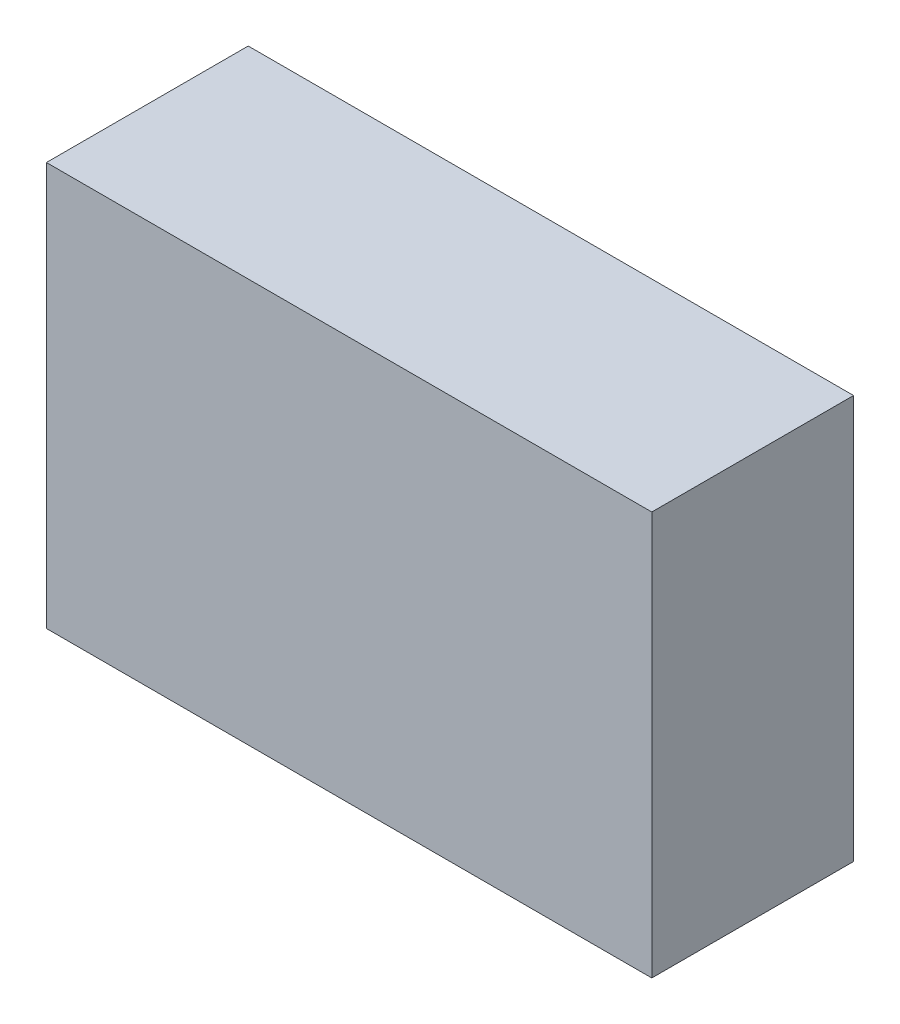
ISO-10303-21;
HEADER;
FILE_DESCRIPTION(('STEP AP214'),'2;1');
FILE_NAME('part.step','',(''),(''),'','','');
FILE_SCHEMA(('AUTOMOTIVE_DESIGN { 1 0 10303 214 1 1 1 1 }'));
ENDSEC;
DATA;
#1=APPLICATION_CONTEXT('core data for automotive mechanical design processes');
#2=APPLICATION_PROTOCOL_DEFINITION('international standard','automotive_design',2000,#1);
#3=PRODUCT_CONTEXT('',#1,'mechanical');
#4=PRODUCT('Part','Part','',(#3));
#5=PRODUCT_RELATED_PRODUCT_CATEGORY('part','',(#4));
#6=PRODUCT_DEFINITION_FORMATION('','',#4);
#7=PRODUCT_DEFINITION_CONTEXT('part definition',#1,'design');
#8=PRODUCT_DEFINITION('design','',#6,#7);
#9=PRODUCT_DEFINITION_SHAPE('','',#8);
#10=(LENGTH_UNIT() NAMED_UNIT(*) SI_UNIT(.MILLI.,.METRE.));
#11=(NAMED_UNIT(*) PLANE_ANGLE_UNIT() SI_UNIT($,.RADIAN.));
#12=(NAMED_UNIT(*) SI_UNIT($,.STERADIAN.) SOLID_ANGLE_UNIT());
#13=UNCERTAINTY_MEASURE_WITH_UNIT(LENGTH_MEASURE(1.E-05),#10,'distance_accuracy_value','');
#14=(GEOMETRIC_REPRESENTATION_CONTEXT(3) GLOBAL_UNCERTAINTY_ASSIGNED_CONTEXT((#13)) GLOBAL_UNIT_ASSIGNED_CONTEXT((#10,
#11,#12)) REPRESENTATION_CONTEXT('',''));
#15=CARTESIAN_POINT('',(0.,0.,0.));
#16=DIRECTION('',(0.,0.,1.));
#17=DIRECTION('',(1.,0.,0.));
#18=AXIS2_PLACEMENT_3D('',#15,#16,#17);
#19=CARTESIAN_POINT('',(0.,0.,1.));
#20=DIRECTION('',(1.,0.,0.));
#21=DIRECTION('',(0.,0.,-1.));
#22=AXIS2_PLACEMENT_3D('',#19,#20,#21);
#23=PLANE('',#22);
#24=DIRECTION('',(0.,-1.,0.));
#25=VECTOR('',#24,1.);
#26=CARTESIAN_POINT('',(0.,0.,0.));
#27=LINE('',#26,#25);
#28=CARTESIAN_POINT('',(0.,2.,0.));
#29=VERTEX_POINT('',#28);
#30=CARTESIAN_POINT('',(0.,0.,0.));
#31=VERTEX_POINT('',#30);
#32=EDGE_CURVE('E107',#29,#31,#27,.T.);
#33=ORIENTED_EDGE('',*,*,#32,.T.);
#34=DIRECTION('',(0.,0.,-1.));
#35=VECTOR('',#34,1.);
#36=CARTESIAN_POINT('',(0.,0.,1.));
#37=LINE('',#36,#35);
#38=CARTESIAN_POINT('',(0.,0.,1.));
#39=VERTEX_POINT('',#38);
#40=EDGE_CURVE('E11',#39,#31,#37,.T.);
#41=ORIENTED_EDGE('',*,*,#40,.F.);
#42=DIRECTION('',(0.,-1.,0.));
#43=VECTOR('',#42,1.);
#44=CARTESIAN_POINT('',(0.,0.,1.));
#45=LINE('',#44,#43);
#46=CARTESIAN_POINT('',(0.,2.,1.));
#47=VERTEX_POINT('',#46);
#48=EDGE_CURVE('E91',#47,#39,#45,.T.);
#49=ORIENTED_EDGE('',*,*,#48,.F.);
#50=DIRECTION('',(0.,0.,-1.));
#51=VECTOR('',#50,1.);
#52=CARTESIAN_POINT('',(0.,2.,1.));
#53=LINE('',#52,#51);
#54=EDGE_CURVE('E103',#47,#29,#53,.T.);
#55=ORIENTED_EDGE('',*,*,#54,.T.);
#56=EDGE_LOOP('',(#33,#41,#49,#55));
#57=FACE_BOUND('',#56,.T.);
#58=ADVANCED_FACE('F39',(#57),#23,.F.);
#59=CARTESIAN_POINT('',(0.,0.,1.));
#60=DIRECTION('',(0.,1.,0.));
#61=DIRECTION('',(0.,0.,1.));
#62=AXIS2_PLACEMENT_3D('',#59,#60,#61);
#63=PLANE('',#62);
#64=DIRECTION('',(1.,0.,0.));
#65=VECTOR('',#64,1.);
#66=CARTESIAN_POINT('',(0.,0.,0.));
#67=LINE('',#66,#65);
#68=CARTESIAN_POINT('',(3.,0.,0.));
#69=VERTEX_POINT('',#68);
#70=EDGE_CURVE('E96',#31,#69,#67,.T.);
#71=ORIENTED_EDGE('',*,*,#70,.T.);
#72=DIRECTION('',(0.,0.,-1.));
#73=VECTOR('',#72,1.);
#74=CARTESIAN_POINT('',(3.,0.,1.));
#75=LINE('',#74,#73);
#76=CARTESIAN_POINT('',(3.,0.,1.));
#77=VERTEX_POINT('',#76);
#78=EDGE_CURVE('E48',#77,#69,#75,.T.);
#79=ORIENTED_EDGE('',*,*,#78,.F.);
#80=DIRECTION('',(1.,0.,0.));
#81=VECTOR('',#80,1.);
#82=CARTESIAN_POINT('',(0.,0.,1.));
#83=LINE('',#82,#81);
#84=EDGE_CURVE('E86',#39,#77,#83,.T.);
#85=ORIENTED_EDGE('',*,*,#84,.F.);
#86=ORIENTED_EDGE('',*,*,#40,.T.);
#87=EDGE_LOOP('',(#71,#79,#85,#86));
#88=FACE_BOUND('',#87,.T.);
#89=ADVANCED_FACE('F95',(#88),#63,.F.);
#90=CARTESIAN_POINT('',(3.,0.,1.));
#91=DIRECTION('',(-1.,0.,0.));
#92=DIRECTION('',(0.,0.,1.));
#93=AXIS2_PLACEMENT_3D('',#90,#91,#92);
#94=PLANE('',#93);
#95=DIRECTION('',(0.,1.,0.));
#96=VECTOR('',#95,1.);
#97=CARTESIAN_POINT('',(3.,0.,0.));
#98=LINE('',#97,#96);
#99=CARTESIAN_POINT('',(3.,2.,0.));
#100=VERTEX_POINT('',#99);
#101=EDGE_CURVE('E73',#69,#100,#98,.T.);
#102=ORIENTED_EDGE('',*,*,#101,.T.);
#103=DIRECTION('',(0.,0.,-1.));
#104=VECTOR('',#103,1.);
#105=CARTESIAN_POINT('',(3.,2.,1.));
#106=LINE('',#105,#104);
#107=CARTESIAN_POINT('',(3.,2.,1.));
#108=VERTEX_POINT('',#107);
#109=EDGE_CURVE('E98',#108,#100,#106,.T.);
#110=ORIENTED_EDGE('',*,*,#109,.F.);
#111=DIRECTION('',(0.,1.,0.));
#112=VECTOR('',#111,1.);
#113=CARTESIAN_POINT('',(3.,0.,1.));
#114=LINE('',#113,#112);
#115=EDGE_CURVE('E89',#77,#108,#114,.T.);
#116=ORIENTED_EDGE('',*,*,#115,.F.);
#117=ORIENTED_EDGE('',*,*,#78,.T.);
#118=EDGE_LOOP('',(#102,#110,#116,#117));
#119=FACE_BOUND('',#118,.T.);
#120=ADVANCED_FACE('F99',(#119),#94,.F.);
#121=CARTESIAN_POINT('',(0.,2.,1.));
#122=DIRECTION('',(0.,-1.,0.));
#123=DIRECTION('',(0.,0.,-1.));
#124=AXIS2_PLACEMENT_3D('',#121,#122,#123);
#125=PLANE('',#124);
#126=DIRECTION('',(-1.,0.,0.));
#127=VECTOR('',#126,1.);
#128=CARTESIAN_POINT('',(0.,2.,0.));
#129=LINE('',#128,#127);
#130=EDGE_CURVE('E79',#100,#29,#129,.T.);
#131=ORIENTED_EDGE('',*,*,#130,.T.);
#132=ORIENTED_EDGE('',*,*,#54,.F.);
#133=DIRECTION('',(-1.,0.,0.));
#134=VECTOR('',#133,1.);
#135=CARTESIAN_POINT('',(0.,2.,1.));
#136=LINE('',#135,#134);
#137=EDGE_CURVE('E56',#108,#47,#136,.T.);
#138=ORIENTED_EDGE('',*,*,#137,.F.);
#139=ORIENTED_EDGE('',*,*,#109,.T.);
#140=EDGE_LOOP('',(#131,#132,#138,#139));
#141=FACE_BOUND('',#140,.T.);
#142=ADVANCED_FACE('F120',(#141),#125,.F.);
#143=CARTESIAN_POINT('',(0.,0.,1.));
#144=DIRECTION('',(0.,0.,-1.));
#145=DIRECTION('',(-1.,0.,0.));
#146=AXIS2_PLACEMENT_3D('',#143,#144,#145);
#147=PLANE('',#146);
#148=ORIENTED_EDGE('',*,*,#48,.T.);
#149=ORIENTED_EDGE('',*,*,#84,.T.);
#150=ORIENTED_EDGE('',*,*,#115,.T.);
#151=ORIENTED_EDGE('',*,*,#137,.T.);
#152=EDGE_LOOP('',(#148,#149,#150,#151));
#153=FACE_BOUND('',#152,.T.);
#154=ADVANCED_FACE('F87',(#153),#147,.F.);
#155=CARTESIAN_POINT('',(0.,0.,0.));
#156=DIRECTION('',(0.,0.,-1.));
#157=DIRECTION('',(-1.,0.,0.));
#158=AXIS2_PLACEMENT_3D('',#155,#156,#157);
#159=PLANE('',#158);
#160=ORIENTED_EDGE('',*,*,#32,.F.);
#161=ORIENTED_EDGE('',*,*,#130,.F.);
#162=ORIENTED_EDGE('',*,*,#101,.F.);
#163=ORIENTED_EDGE('',*,*,#70,.F.);
#164=EDGE_LOOP('',(#160,#161,#162,#163));
#165=FACE_BOUND('',#164,.T.);
#166=ADVANCED_FACE('F123',(#165),#159,.T.);
#167=CLOSED_SHELL('',(#58,#89,#120,#142,#154,#166));
#168=MANIFOLD_SOLID_BREP('B2',#167);
#169=ADVANCED_BREP_SHAPE_REPRESENTATION('',(#18,#168),#14);
#170=SHAPE_DEFINITION_REPRESENTATION(#9,#169);
ENDSEC;
END-ISO-10303-21;
